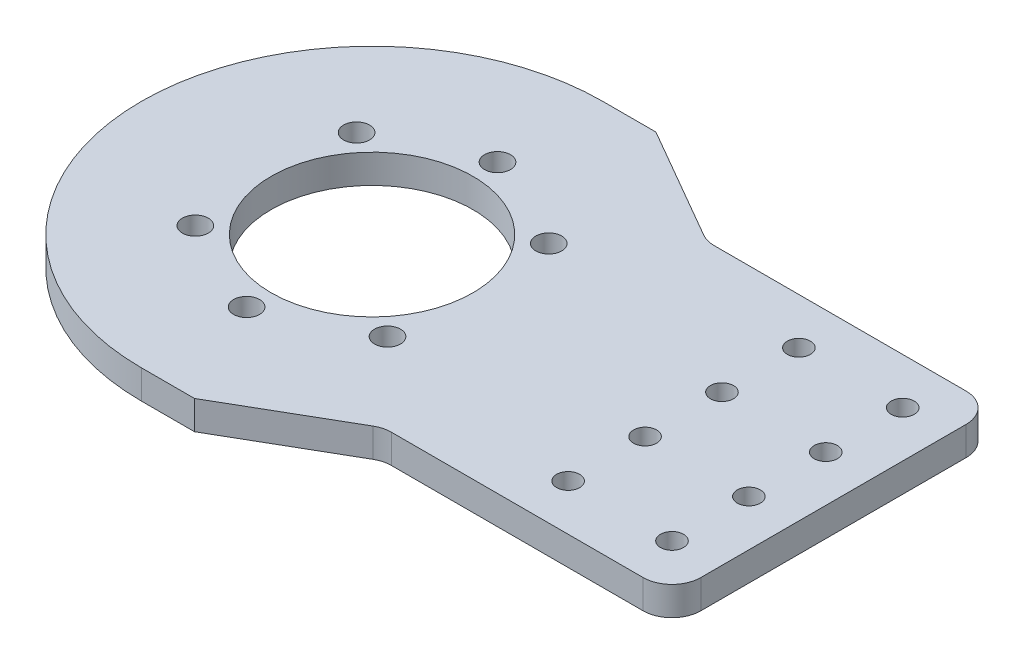
ISO-10303-21;
HEADER;
FILE_DESCRIPTION(('STEP AP214'),'2;1');
FILE_NAME('part.step','',(''),(''),'','','');
FILE_SCHEMA(('AUTOMOTIVE_DESIGN { 1 0 10303 214 1 1 1 1 }'));
ENDSEC;
DATA;
#1=APPLICATION_CONTEXT('core data for automotive mechanical design processes');
#2=APPLICATION_PROTOCOL_DEFINITION('international standard','automotive_design',2000,#1);
#3=PRODUCT_CONTEXT('',#1,'mechanical');
#4=PRODUCT('Part','Part','',(#3));
#5=PRODUCT_RELATED_PRODUCT_CATEGORY('part','',(#4));
#6=PRODUCT_DEFINITION_FORMATION('','',#4);
#7=PRODUCT_DEFINITION_CONTEXT('part definition',#1,'design');
#8=PRODUCT_DEFINITION('design','',#6,#7);
#9=PRODUCT_DEFINITION_SHAPE('','',#8);
#10=(LENGTH_UNIT() NAMED_UNIT(*) SI_UNIT(.MILLI.,.METRE.));
#11=(NAMED_UNIT(*) PLANE_ANGLE_UNIT() SI_UNIT($,.RADIAN.));
#12=(NAMED_UNIT(*) SI_UNIT($,.STERADIAN.) SOLID_ANGLE_UNIT());
#13=UNCERTAINTY_MEASURE_WITH_UNIT(LENGTH_MEASURE(1.E-05),#10,'distance_accuracy_value','');
#14=(GEOMETRIC_REPRESENTATION_CONTEXT(3) GLOBAL_UNCERTAINTY_ASSIGNED_CONTEXT((#13)) GLOBAL_UNIT_ASSIGNED_CONTEXT((#10,
#11,#12)) REPRESENTATION_CONTEXT('',''));
#15=CARTESIAN_POINT('',(0.,0.,0.));
#16=DIRECTION('',(0.,0.,1.));
#17=DIRECTION('',(1.,0.,0.));
#18=AXIS2_PLACEMENT_3D('',#15,#16,#17);
#19=CARTESIAN_POINT('',(-270.,-5.,95.));
#20=DIRECTION('',(0.,1.,0.));
#21=DIRECTION('',(0.,0.,1.));
#22=AXIS2_PLACEMENT_3D('',#19,#20,#21);
#23=PLANE('',#22);
#24=CARTESIAN_POINT('',(-229.338533362162,-5.,33.5193694893178));
#25=DIRECTION('',(0.,1.,0.));
#26=DIRECTION('',(0.,0.,1.));
#27=AXIS2_PLACEMENT_3D('',#24,#25,#26);
#28=CIRCLE('',#27,2.25000000000001);
#29=CARTESIAN_POINT('',(-229.338533362162,-5.,35.7693694893178));
#30=VERTEX_POINT('',#29);
#31=EDGE_CURVE('E199',#30,#30,#28,.T.);
#32=ORIENTED_EDGE('',*,*,#31,.T.);
#33=EDGE_LOOP('',(#32));
#34=FACE_BOUND('',#33,.T.);
#35=CARTESIAN_POINT('',(-262.661466637838,-5.,33.5193694893178));
#36=DIRECTION('',(0.,1.,0.));
#37=DIRECTION('',(0.,0.,1.));
#38=AXIS2_PLACEMENT_3D('',#35,#36,#37);
#39=CIRCLE('',#38,2.25000000000001);
#40=CARTESIAN_POINT('',(-262.661466637838,-5.,35.7693694893178));
#41=VERTEX_POINT('',#40);
#42=EDGE_CURVE('E226',#41,#41,#39,.T.);
#43=ORIENTED_EDGE('',*,*,#42,.T.);
#44=EDGE_LOOP('',(#43));
#45=FACE_BOUND('',#44,.T.);
#46=CARTESIAN_POINT('',(-262.661466637838,-5.,61.4806305106822));
#47=DIRECTION('',(0.,1.,0.));
#48=DIRECTION('',(0.,0.,1.));
#49=AXIS2_PLACEMENT_3D('',#46,#47,#48);
#50=CIRCLE('',#49,2.25000000000001);
#51=CARTESIAN_POINT('',(-262.661466637838,-5.,63.7306305106822));
#52=VERTEX_POINT('',#51);
#53=EDGE_CURVE('E230',#52,#52,#50,.T.);
#54=ORIENTED_EDGE('',*,*,#53,.T.);
#55=EDGE_LOOP('',(#54));
#56=FACE_BOUND('',#55,.T.);
#57=CARTESIAN_POINT('',(-246.,-5.,69.25));
#58=DIRECTION('',(0.,1.,0.));
#59=DIRECTION('',(0.,0.,1.));
#60=AXIS2_PLACEMENT_3D('',#57,#58,#59);
#61=CIRCLE('',#60,2.25000000000001);
#62=CARTESIAN_POINT('',(-246.,-5.,71.5));
#63=VERTEX_POINT('',#62);
#64=EDGE_CURVE('E234',#63,#63,#61,.T.);
#65=ORIENTED_EDGE('',*,*,#64,.T.);
#66=EDGE_LOOP('',(#65));
#67=FACE_BOUND('',#66,.T.);
#68=CARTESIAN_POINT('',(-246.,-5.,47.5));
#69=DIRECTION('',(0.,1.,0.));
#70=DIRECTION('',(0.,0.,1.));
#71=AXIS2_PLACEMENT_3D('',#68,#69,#70);
#72=CIRCLE('',#71,17.5);
#73=CARTESIAN_POINT('',(-246.,-5.,65.));
#74=VERTEX_POINT('',#73);
#75=EDGE_CURVE('E238',#74,#74,#72,.T.);
#76=ORIENTED_EDGE('',*,*,#75,.T.);
#77=EDGE_LOOP('',(#76));
#78=FACE_BOUND('',#77,.T.);
#79=CARTESIAN_POINT('',(-229.338533362162,-5.,61.4806305106822));
#80=DIRECTION('',(0.,1.,0.));
#81=DIRECTION('',(0.,0.,1.));
#82=AXIS2_PLACEMENT_3D('',#79,#80,#81);
#83=CIRCLE('',#82,2.25000000000001);
#84=CARTESIAN_POINT('',(-229.338533362162,-5.,63.7306305106822));
#85=VERTEX_POINT('',#84);
#86=EDGE_CURVE('E242',#85,#85,#83,.T.);
#87=ORIENTED_EDGE('',*,*,#86,.T.);
#88=EDGE_LOOP('',(#87));
#89=FACE_BOUND('',#88,.T.);
#90=CARTESIAN_POINT('',(-246.,-5.,25.75));
#91=DIRECTION('',(0.,1.,0.));
#92=DIRECTION('',(0.,0.,1.));
#93=AXIS2_PLACEMENT_3D('',#90,#91,#92);
#94=CIRCLE('',#93,2.25000000000001);
#95=CARTESIAN_POINT('',(-246.,-5.,28.));
#96=VERTEX_POINT('',#95);
#97=EDGE_CURVE('E246',#96,#96,#94,.T.);
#98=ORIENTED_EDGE('',*,*,#97,.T.);
#99=EDGE_LOOP('',(#98));
#100=FACE_BOUND('',#99,.T.);
#101=CARTESIAN_POINT('',(-192.,-5.,27.5));
#102=DIRECTION('',(0.,1.,0.));
#103=DIRECTION('',(0.,0.,1.));
#104=AXIS2_PLACEMENT_3D('',#101,#102,#103);
#105=CIRCLE('',#104,2.);
#106=CARTESIAN_POINT('',(-192.,-5.,29.5));
#107=VERTEX_POINT('',#106);
#108=EDGE_CURVE('E182',#107,#107,#105,.T.);
#109=ORIENTED_EDGE('',*,*,#108,.T.);
#110=EDGE_LOOP('',(#109));
#111=FACE_BOUND('',#110,.T.);
#112=CARTESIAN_POINT('',(-174.,-5.,27.5));
#113=DIRECTION('',(0.,1.,0.));
#114=DIRECTION('',(0.,0.,1.));
#115=AXIS2_PLACEMENT_3D('',#112,#113,#114);
#116=CIRCLE('',#115,2.);
#117=CARTESIAN_POINT('',(-174.,-5.,29.5));
#118=VERTEX_POINT('',#117);
#119=EDGE_CURVE('E329',#118,#118,#116,.T.);
#120=ORIENTED_EDGE('',*,*,#119,.T.);
#121=EDGE_LOOP('',(#120));
#122=FACE_BOUND('',#121,.T.);
#123=CARTESIAN_POINT('',(-174.,-5.,40.8333333333333));
#124=DIRECTION('',(0.,1.,0.));
#125=DIRECTION('',(0.,0.,1.));
#126=AXIS2_PLACEMENT_3D('',#123,#124,#125);
#127=CIRCLE('',#126,2.);
#128=CARTESIAN_POINT('',(-174.,-5.,42.8333333333333));
#129=VERTEX_POINT('',#128);
#130=EDGE_CURVE('E338',#129,#129,#127,.T.);
#131=ORIENTED_EDGE('',*,*,#130,.T.);
#132=EDGE_LOOP('',(#131));
#133=FACE_BOUND('',#132,.T.);
#134=CARTESIAN_POINT('',(-174.,-5.,54.1666666666667));
#135=DIRECTION('',(0.,1.,0.));
#136=DIRECTION('',(0.,0.,1.));
#137=AXIS2_PLACEMENT_3D('',#134,#135,#136);
#138=CIRCLE('',#137,2.);
#139=CARTESIAN_POINT('',(-174.,-5.,56.1666666666667));
#140=VERTEX_POINT('',#139);
#141=EDGE_CURVE('E346',#140,#140,#138,.T.);
#142=ORIENTED_EDGE('',*,*,#141,.T.);
#143=EDGE_LOOP('',(#142));
#144=FACE_BOUND('',#143,.T.);
#145=CARTESIAN_POINT('',(-174.,-5.,67.5));
#146=DIRECTION('',(0.,1.,0.));
#147=DIRECTION('',(0.,0.,1.));
#148=AXIS2_PLACEMENT_3D('',#145,#146,#147);
#149=CIRCLE('',#148,2.);
#150=CARTESIAN_POINT('',(-174.,-5.,69.5));
#151=VERTEX_POINT('',#150);
#152=EDGE_CURVE('E354',#151,#151,#149,.T.);
#153=ORIENTED_EDGE('',*,*,#152,.T.);
#154=EDGE_LOOP('',(#153));
#155=FACE_BOUND('',#154,.T.);
#156=CARTESIAN_POINT('',(-192.,-5.,40.8333333333333));
#157=DIRECTION('',(0.,1.,0.));
#158=DIRECTION('',(0.,0.,1.));
#159=AXIS2_PLACEMENT_3D('',#156,#157,#158);
#160=CIRCLE('',#159,2.);
#161=CARTESIAN_POINT('',(-192.,-5.,42.8333333333333));
#162=VERTEX_POINT('',#161);
#163=EDGE_CURVE('E362',#162,#162,#160,.T.);
#164=ORIENTED_EDGE('',*,*,#163,.T.);
#165=EDGE_LOOP('',(#164));
#166=FACE_BOUND('',#165,.T.);
#167=CARTESIAN_POINT('',(-192.,-5.,54.1666666666667));
#168=DIRECTION('',(0.,1.,0.));
#169=DIRECTION('',(0.,0.,1.));
#170=AXIS2_PLACEMENT_3D('',#167,#168,#169);
#171=CIRCLE('',#170,2.);
#172=CARTESIAN_POINT('',(-192.,-5.,56.1666666666667));
#173=VERTEX_POINT('',#172);
#174=EDGE_CURVE('E370',#173,#173,#171,.T.);
#175=ORIENTED_EDGE('',*,*,#174,.T.);
#176=EDGE_LOOP('',(#175));
#177=FACE_BOUND('',#176,.T.);
#178=CARTESIAN_POINT('',(-192.,-5.,67.5));
#179=DIRECTION('',(0.,1.,0.));
#180=DIRECTION('',(0.,0.,1.));
#181=AXIS2_PLACEMENT_3D('',#178,#179,#180);
#182=CIRCLE('',#181,2.);
#183=CARTESIAN_POINT('',(-192.,-5.,69.5));
#184=VERTEX_POINT('',#183);
#185=EDGE_CURVE('E378',#184,#184,#182,.T.);
#186=ORIENTED_EDGE('',*,*,#185,.T.);
#187=EDGE_LOOP('',(#186));
#188=FACE_BOUND('',#187,.T.);
#189=DIRECTION('',(0.,0.,-1.));
#190=VECTOR('',#189,1.);
#191=CARTESIAN_POINT('',(-166.,-5.,7.5));
#192=LINE('',#191,#190);
#193=CARTESIAN_POINT('',(-166.,-5.,70.5));
#194=VERTEX_POINT('',#193);
#195=CARTESIAN_POINT('',(-166.,-5.,24.5));
#196=VERTEX_POINT('',#195);
#197=EDGE_CURVE('E166',#194,#196,#192,.T.);
#198=ORIENTED_EDGE('',*,*,#197,.F.);
#199=CARTESIAN_POINT('',(-171.,-5.,70.5));
#200=DIRECTION('',(0.,1.,0.));
#201=DIRECTION('',(0.,0.,1.));
#202=AXIS2_PLACEMENT_3D('',#199,#200,#201);
#203=CIRCLE('',#202,5.);
#204=CARTESIAN_POINT('',(-171.,-5.,75.5));
#205=VERTEX_POINT('',#204);
#206=EDGE_CURVE('E273',#194,#205,#203,.F.);
#207=ORIENTED_EDGE('',*,*,#206,.T.);
#208=DIRECTION('',(1.,0.,0.));
#209=VECTOR('',#208,1.);
#210=CARTESIAN_POINT('',(0.,-5.,75.5));
#211=LINE('',#210,#209);
#212=CARTESIAN_POINT('',(-214.660254037844,-5.,75.5));
#213=VERTEX_POINT('',#212);
#214=EDGE_CURVE('E315',#213,#205,#211,.T.);
#215=ORIENTED_EDGE('',*,*,#214,.F.);
#216=CARTESIAN_POINT('',(-214.660254037844,-5.,80.5));
#217=DIRECTION('',(0.,1.,0.));
#218=DIRECTION('',(0.,0.,1.));
#219=AXIS2_PLACEMENT_3D('',#216,#217,#218);
#220=CIRCLE('',#219,5.);
#221=CARTESIAN_POINT('',(-217.160254037844,-5.,76.1698729810778));
#222=VERTEX_POINT('',#221);
#223=EDGE_CURVE('E59',#213,#222,#220,.T.);
#224=ORIENTED_EDGE('',*,*,#223,.T.);
#225=DIRECTION('',(0.866025403784438,0.,-0.500000000000001));
#226=VECTOR('',#225,1.);
#227=CARTESIAN_POINT('',(-21.3075410071376,-5.,-36.9057436087196));
#228=LINE('',#227,#226);
#229=CARTESIAN_POINT('',(-236.784609690826,-5.,87.5));
#230=VERTEX_POINT('',#229);
#231=EDGE_CURVE('E312',#230,#222,#228,.T.);
#232=ORIENTED_EDGE('',*,*,#231,.F.);
#233=DIRECTION('',(1.,0.,0.));
#234=VECTOR('',#233,1.);
#235=CARTESIAN_POINT('',(-246.,-5.,87.5));
#236=LINE('',#235,#234);
#237=CARTESIAN_POINT('',(-246.,-5.,87.5));
#238=VERTEX_POINT('',#237);
#239=EDGE_CURVE('E173',#238,#230,#236,.T.);
#240=ORIENTED_EDGE('',*,*,#239,.F.);
#241=CARTESIAN_POINT('',(-246.,-5.,47.5));
#242=DIRECTION('',(0.,1.,0.));
#243=DIRECTION('',(0.,0.,1.));
#244=AXIS2_PLACEMENT_3D('',#241,#242,#243);
#245=CIRCLE('',#244,40.);
#246=CARTESIAN_POINT('',(-246.,-5.,7.49999999999999));
#247=VERTEX_POINT('',#246);
#248=EDGE_CURVE('E163',#247,#238,#245,.T.);
#249=ORIENTED_EDGE('',*,*,#248,.F.);
#250=DIRECTION('',(-1.,0.,0.));
#251=VECTOR('',#250,1.);
#252=CARTESIAN_POINT('',(-246.,-5.,7.49999999999999));
#253=LINE('',#252,#251);
#254=CARTESIAN_POINT('',(-236.784609690826,-5.,7.49999999999999));
#255=VERTEX_POINT('',#254);
#256=EDGE_CURVE('E153',#255,#247,#253,.T.);
#257=ORIENTED_EDGE('',*,*,#256,.F.);
#258=DIRECTION('',(0.866025403784438,0.,0.500000000000001));
#259=VECTOR('',#258,1.);
#260=CARTESIAN_POINT('',(-62.4437476868986,-5.,108.15574360872));
#261=LINE('',#260,#259);
#262=CARTESIAN_POINT('',(-217.160254037844,-5.,18.8301270189222));
#263=VERTEX_POINT('',#262);
#264=EDGE_CURVE('E135',#255,#263,#261,.T.);
#265=ORIENTED_EDGE('',*,*,#264,.T.);
#266=CARTESIAN_POINT('',(-214.660254037844,-5.,14.5));
#267=DIRECTION('',(0.,1.,0.));
#268=DIRECTION('',(0.,0.,1.));
#269=AXIS2_PLACEMENT_3D('',#266,#267,#268);
#270=CIRCLE('',#269,5.);
#271=CARTESIAN_POINT('',(-214.660254037844,-5.,19.5));
#272=VERTEX_POINT('',#271);
#273=EDGE_CURVE('E11',#263,#272,#270,.T.);
#274=ORIENTED_EDGE('',*,*,#273,.T.);
#275=DIRECTION('',(1.,0.,0.));
#276=VECTOR('',#275,1.);
#277=CARTESIAN_POINT('',(0.,-5.,19.5));
#278=LINE('',#277,#276);
#279=CARTESIAN_POINT('',(-171.,-5.,19.5));
#280=VERTEX_POINT('',#279);
#281=EDGE_CURVE('E146',#272,#280,#278,.T.);
#282=ORIENTED_EDGE('',*,*,#281,.T.);
#283=CARTESIAN_POINT('',(-171.,-5.,24.5));
#284=DIRECTION('',(0.,1.,0.));
#285=DIRECTION('',(0.,0.,1.));
#286=AXIS2_PLACEMENT_3D('',#283,#284,#285);
#287=CIRCLE('',#286,5.);
#288=EDGE_CURVE('E270',#280,#196,#287,.F.);
#289=ORIENTED_EDGE('',*,*,#288,.T.);
#290=EDGE_LOOP('',(#198,#207,#215,#224,#232,#240,#249,#257,#265,#274,#282,#289));
#291=FACE_BOUND('',#290,.T.);
#292=ADVANCED_FACE('F43',(#34,#45,#56,#67,#78,#89,#100,#111,#122,#133,#144,#155,#166,#177,#188,
#291),#23,.F.);
#293=CARTESIAN_POINT('',(-270.,0.,95.));
#294=DIRECTION('',(0.,1.,0.));
#295=DIRECTION('',(0.,0.,1.));
#296=AXIS2_PLACEMENT_3D('',#293,#294,#295);
#297=PLANE('',#296);
#298=DIRECTION('',(1.,0.,0.));
#299=VECTOR('',#298,1.);
#300=CARTESIAN_POINT('',(0.,0.,75.5));
#301=LINE('',#300,#299);
#302=CARTESIAN_POINT('',(-214.660254037844,0.,75.5));
#303=VERTEX_POINT('',#302);
#304=CARTESIAN_POINT('',(-171.,0.,75.5));
#305=VERTEX_POINT('',#304);
#306=EDGE_CURVE('E316',#303,#305,#301,.T.);
#307=ORIENTED_EDGE('',*,*,#306,.T.);
#308=CARTESIAN_POINT('',(-171.,0.,70.5));
#309=DIRECTION('',(0.,1.,0.));
#310=DIRECTION('',(0.,0.,1.));
#311=AXIS2_PLACEMENT_3D('',#308,#309,#310);
#312=CIRCLE('',#311,5.);
#313=CARTESIAN_POINT('',(-166.,0.,70.5));
#314=VERTEX_POINT('',#313);
#315=EDGE_CURVE('E260',#305,#314,#312,.T.);
#316=ORIENTED_EDGE('',*,*,#315,.T.);
#317=DIRECTION('',(0.,0.,-1.));
#318=VECTOR('',#317,1.);
#319=CARTESIAN_POINT('',(-166.,0.,7.5));
#320=LINE('',#319,#318);
#321=CARTESIAN_POINT('',(-166.,0.,24.5));
#322=VERTEX_POINT('',#321);
#323=EDGE_CURVE('E186',#314,#322,#320,.T.);
#324=ORIENTED_EDGE('',*,*,#323,.T.);
#325=CARTESIAN_POINT('',(-171.,0.,24.5));
#326=DIRECTION('',(0.,1.,0.));
#327=DIRECTION('',(0.,0.,1.));
#328=AXIS2_PLACEMENT_3D('',#325,#326,#327);
#329=CIRCLE('',#328,5.);
#330=CARTESIAN_POINT('',(-171.,0.,19.5));
#331=VERTEX_POINT('',#330);
#332=EDGE_CURVE('E257',#322,#331,#329,.T.);
#333=ORIENTED_EDGE('',*,*,#332,.T.);
#334=DIRECTION('',(1.,0.,0.));
#335=VECTOR('',#334,1.);
#336=CARTESIAN_POINT('',(0.,0.,19.5));
#337=LINE('',#336,#335);
#338=CARTESIAN_POINT('',(-214.660254037844,0.,19.5));
#339=VERTEX_POINT('',#338);
#340=EDGE_CURVE('E147',#339,#331,#337,.T.);
#341=ORIENTED_EDGE('',*,*,#340,.F.);
#342=CARTESIAN_POINT('',(-214.660254037844,0.,14.5));
#343=DIRECTION('',(0.,1.,0.));
#344=DIRECTION('',(0.,0.,1.));
#345=AXIS2_PLACEMENT_3D('',#342,#343,#344);
#346=CIRCLE('',#345,5.);
#347=CARTESIAN_POINT('',(-217.160254037844,0.,18.8301270189222));
#348=VERTEX_POINT('',#347);
#349=EDGE_CURVE('E52',#339,#348,#346,.F.);
#350=ORIENTED_EDGE('',*,*,#349,.T.);
#351=DIRECTION('',(0.866025403784438,0.,0.500000000000001));
#352=VECTOR('',#351,1.);
#353=CARTESIAN_POINT('',(-62.4437476868986,0.,108.15574360872));
#354=LINE('',#353,#352);
#355=CARTESIAN_POINT('',(-236.784609690826,0.,7.49999999999999));
#356=VERTEX_POINT('',#355);
#357=EDGE_CURVE('E298',#356,#348,#354,.T.);
#358=ORIENTED_EDGE('',*,*,#357,.F.);
#359=DIRECTION('',(-1.,0.,0.));
#360=VECTOR('',#359,1.);
#361=CARTESIAN_POINT('',(-246.,0.,7.49999999999999));
#362=LINE('',#361,#360);
#363=CARTESIAN_POINT('',(-246.,0.,7.49999999999999));
#364=VERTEX_POINT('',#363);
#365=EDGE_CURVE('E155',#356,#364,#362,.T.);
#366=ORIENTED_EDGE('',*,*,#365,.T.);
#367=CARTESIAN_POINT('',(-246.,0.,47.5));
#368=DIRECTION('',(0.,1.,0.));
#369=DIRECTION('',(0.,0.,1.));
#370=AXIS2_PLACEMENT_3D('',#367,#368,#369);
#371=CIRCLE('',#370,40.);
#372=CARTESIAN_POINT('',(-246.,0.,87.5));
#373=VERTEX_POINT('',#372);
#374=EDGE_CURVE('E177',#364,#373,#371,.T.);
#375=ORIENTED_EDGE('',*,*,#374,.T.);
#376=DIRECTION('',(1.,0.,0.));
#377=VECTOR('',#376,1.);
#378=CARTESIAN_POINT('',(-246.,0.,87.5));
#379=LINE('',#378,#377);
#380=CARTESIAN_POINT('',(-236.784609690826,0.,87.5));
#381=VERTEX_POINT('',#380);
#382=EDGE_CURVE('E181',#373,#381,#379,.T.);
#383=ORIENTED_EDGE('',*,*,#382,.T.);
#384=DIRECTION('',(0.866025403784438,0.,-0.500000000000001));
#385=VECTOR('',#384,1.);
#386=CARTESIAN_POINT('',(-21.3075410071376,0.,-36.9057436087196));
#387=LINE('',#386,#385);
#388=CARTESIAN_POINT('',(-217.160254037844,0.,76.1698729810778));
#389=VERTEX_POINT('',#388);
#390=EDGE_CURVE('E320',#381,#389,#387,.T.);
#391=ORIENTED_EDGE('',*,*,#390,.T.);
#392=CARTESIAN_POINT('',(-214.660254037844,0.,80.5));
#393=DIRECTION('',(0.,1.,0.));
#394=DIRECTION('',(0.,0.,1.));
#395=AXIS2_PLACEMENT_3D('',#392,#393,#394);
#396=CIRCLE('',#395,5.);
#397=EDGE_CURVE('E288',#389,#303,#396,.F.);
#398=ORIENTED_EDGE('',*,*,#397,.T.);
#399=EDGE_LOOP('',(#307,#316,#324,#333,#341,#350,#358,#366,#375,#383,#391,#398));
#400=FACE_BOUND('',#399,.T.);
#401=CARTESIAN_POINT('',(-192.,0.,67.5));
#402=DIRECTION('',(0.,1.,0.));
#403=DIRECTION('',(0.,0.,1.));
#404=AXIS2_PLACEMENT_3D('',#401,#402,#403);
#405=CIRCLE('',#404,2.);
#406=CARTESIAN_POINT('',(-192.,0.,69.5));
#407=VERTEX_POINT('',#406);
#408=EDGE_CURVE('E157',#407,#407,#405,.T.);
#409=ORIENTED_EDGE('',*,*,#408,.F.);
#410=EDGE_LOOP('',(#409));
#411=FACE_BOUND('',#410,.T.);
#412=CARTESIAN_POINT('',(-192.,0.,54.1666666666667));
#413=DIRECTION('',(0.,1.,0.));
#414=DIRECTION('',(0.,0.,1.));
#415=AXIS2_PLACEMENT_3D('',#412,#413,#414);
#416=CIRCLE('',#415,2.);
#417=CARTESIAN_POINT('',(-192.,0.,56.1666666666667));
#418=VERTEX_POINT('',#417);
#419=EDGE_CURVE('E374',#418,#418,#416,.T.);
#420=ORIENTED_EDGE('',*,*,#419,.F.);
#421=EDGE_LOOP('',(#420));
#422=FACE_BOUND('',#421,.T.);
#423=CARTESIAN_POINT('',(-192.,0.,40.8333333333333));
#424=DIRECTION('',(0.,1.,0.));
#425=DIRECTION('',(0.,0.,1.));
#426=AXIS2_PLACEMENT_3D('',#423,#424,#425);
#427=CIRCLE('',#426,2.);
#428=CARTESIAN_POINT('',(-192.,0.,42.8333333333333));
#429=VERTEX_POINT('',#428);
#430=EDGE_CURVE('E366',#429,#429,#427,.T.);
#431=ORIENTED_EDGE('',*,*,#430,.F.);
#432=EDGE_LOOP('',(#431));
#433=FACE_BOUND('',#432,.T.);
#434=CARTESIAN_POINT('',(-174.,0.,67.5));
#435=DIRECTION('',(0.,1.,0.));
#436=DIRECTION('',(0.,0.,1.));
#437=AXIS2_PLACEMENT_3D('',#434,#435,#436);
#438=CIRCLE('',#437,2.);
#439=CARTESIAN_POINT('',(-174.,0.,69.5));
#440=VERTEX_POINT('',#439);
#441=EDGE_CURVE('E358',#440,#440,#438,.T.);
#442=ORIENTED_EDGE('',*,*,#441,.F.);
#443=EDGE_LOOP('',(#442));
#444=FACE_BOUND('',#443,.T.);
#445=CARTESIAN_POINT('',(-174.,0.,54.1666666666667));
#446=DIRECTION('',(0.,1.,0.));
#447=DIRECTION('',(0.,0.,1.));
#448=AXIS2_PLACEMENT_3D('',#445,#446,#447);
#449=CIRCLE('',#448,2.);
#450=CARTESIAN_POINT('',(-174.,0.,56.1666666666667));
#451=VERTEX_POINT('',#450);
#452=EDGE_CURVE('E350',#451,#451,#449,.T.);
#453=ORIENTED_EDGE('',*,*,#452,.F.);
#454=EDGE_LOOP('',(#453));
#455=FACE_BOUND('',#454,.T.);
#456=CARTESIAN_POINT('',(-174.,0.,40.8333333333333));
#457=DIRECTION('',(0.,1.,0.));
#458=DIRECTION('',(0.,0.,1.));
#459=AXIS2_PLACEMENT_3D('',#456,#457,#458);
#460=CIRCLE('',#459,2.);
#461=CARTESIAN_POINT('',(-174.,0.,42.8333333333333));
#462=VERTEX_POINT('',#461);
#463=EDGE_CURVE('E342',#462,#462,#460,.T.);
#464=ORIENTED_EDGE('',*,*,#463,.F.);
#465=EDGE_LOOP('',(#464));
#466=FACE_BOUND('',#465,.T.);
#467=CARTESIAN_POINT('',(-174.,0.,27.5));
#468=DIRECTION('',(0.,1.,0.));
#469=DIRECTION('',(0.,0.,1.));
#470=AXIS2_PLACEMENT_3D('',#467,#468,#469);
#471=CIRCLE('',#470,2.);
#472=CARTESIAN_POINT('',(-174.,0.,29.5));
#473=VERTEX_POINT('',#472);
#474=EDGE_CURVE('E334',#473,#473,#471,.T.);
#475=ORIENTED_EDGE('',*,*,#474,.F.);
#476=EDGE_LOOP('',(#475));
#477=FACE_BOUND('',#476,.T.);
#478=CARTESIAN_POINT('',(-192.,0.,27.5));
#479=DIRECTION('',(0.,1.,0.));
#480=DIRECTION('',(0.,0.,1.));
#481=AXIS2_PLACEMENT_3D('',#478,#479,#480);
#482=CIRCLE('',#481,2.);
#483=CARTESIAN_POINT('',(-192.,0.,29.5));
#484=VERTEX_POINT('',#483);
#485=EDGE_CURVE('E333',#484,#484,#482,.T.);
#486=ORIENTED_EDGE('',*,*,#485,.F.);
#487=EDGE_LOOP('',(#486));
#488=FACE_BOUND('',#487,.T.);
#489=CARTESIAN_POINT('',(-246.,0.,25.75));
#490=DIRECTION('',(0.,1.,0.));
#491=DIRECTION('',(0.,0.,1.));
#492=AXIS2_PLACEMENT_3D('',#489,#490,#491);
#493=CIRCLE('',#492,2.25000000000001);
#494=CARTESIAN_POINT('',(-246.,0.,28.));
#495=VERTEX_POINT('',#494);
#496=EDGE_CURVE('E195',#495,#495,#493,.T.);
#497=ORIENTED_EDGE('',*,*,#496,.F.);
#498=EDGE_LOOP('',(#497));
#499=FACE_BOUND('',#498,.T.);
#500=CARTESIAN_POINT('',(-229.338533362162,0.,61.4806305106822));
#501=DIRECTION('',(0.,1.,0.));
#502=DIRECTION('',(0.,0.,-1.));
#503=AXIS2_PLACEMENT_3D('',#500,#501,#502);
#504=CIRCLE('',#503,2.25000000000001);
#505=CARTESIAN_POINT('',(-229.338533362162,0.,59.2306305106822));
#506=VERTEX_POINT('',#505);
#507=EDGE_CURVE('E204',#506,#506,#504,.T.);
#508=ORIENTED_EDGE('',*,*,#507,.F.);
#509=EDGE_LOOP('',(#508));
#510=FACE_BOUND('',#509,.T.);
#511=CARTESIAN_POINT('',(-246.,0.,47.5));
#512=DIRECTION('',(0.,1.,0.));
#513=DIRECTION('',(0.,0.,1.));
#514=AXIS2_PLACEMENT_3D('',#511,#512,#513);
#515=CIRCLE('',#514,17.5);
#516=CARTESIAN_POINT('',(-246.,0.,65.));
#517=VERTEX_POINT('',#516);
#518=EDGE_CURVE('E193',#517,#517,#515,.T.);
#519=ORIENTED_EDGE('',*,*,#518,.F.);
#520=EDGE_LOOP('',(#519));
#521=FACE_BOUND('',#520,.T.);
#522=CARTESIAN_POINT('',(-246.,0.,69.25));
#523=DIRECTION('',(0.,1.,0.));
#524=DIRECTION('',(0.,0.,-1.));
#525=AXIS2_PLACEMENT_3D('',#522,#523,#524);
#526=CIRCLE('',#525,2.25000000000001);
#527=CARTESIAN_POINT('',(-246.,0.,67.));
#528=VERTEX_POINT('',#527);
#529=EDGE_CURVE('E208',#528,#528,#526,.T.);
#530=ORIENTED_EDGE('',*,*,#529,.F.);
#531=EDGE_LOOP('',(#530));
#532=FACE_BOUND('',#531,.T.);
#533=CARTESIAN_POINT('',(-262.661466637838,0.,61.4806305106822));
#534=DIRECTION('',(0.,1.,0.));
#535=DIRECTION('',(0.,0.,1.));
#536=AXIS2_PLACEMENT_3D('',#533,#534,#535);
#537=CIRCLE('',#536,2.25000000000001);
#538=CARTESIAN_POINT('',(-262.661466637838,0.,63.7306305106822));
#539=VERTEX_POINT('',#538);
#540=EDGE_CURVE('E216',#539,#539,#537,.T.);
#541=ORIENTED_EDGE('',*,*,#540,.F.);
#542=EDGE_LOOP('',(#541));
#543=FACE_BOUND('',#542,.T.);
#544=CARTESIAN_POINT('',(-262.661466637838,0.,33.5193694893178));
#545=DIRECTION('',(0.,1.,0.));
#546=DIRECTION('',(0.,0.,-1.));
#547=AXIS2_PLACEMENT_3D('',#544,#545,#546);
#548=CIRCLE('',#547,2.25000000000001);
#549=CARTESIAN_POINT('',(-262.661466637838,0.,31.2693694893178));
#550=VERTEX_POINT('',#549);
#551=EDGE_CURVE('E212',#550,#550,#548,.T.);
#552=ORIENTED_EDGE('',*,*,#551,.F.);
#553=EDGE_LOOP('',(#552));
#554=FACE_BOUND('',#553,.T.);
#555=CARTESIAN_POINT('',(-229.338533362162,0.,33.5193694893178));
#556=DIRECTION('',(0.,1.,0.));
#557=DIRECTION('',(0.,0.,1.));
#558=AXIS2_PLACEMENT_3D('',#555,#556,#557);
#559=CIRCLE('',#558,2.25000000000001);
#560=CARTESIAN_POINT('',(-229.338533362162,0.,35.7693694893178));
#561=VERTEX_POINT('',#560);
#562=EDGE_CURVE('E200',#561,#561,#559,.T.);
#563=ORIENTED_EDGE('',*,*,#562,.F.);
#564=EDGE_LOOP('',(#563));
#565=FACE_BOUND('',#564,.T.);
#566=ADVANCED_FACE('F296',(#400,#411,#422,#433,#444,#455,#466,#477,#488,#499,#510,#521,#532,
#543,#554,#565),#297,.T.);
#567=CARTESIAN_POINT('',(-166.,-5.,7.5));
#568=DIRECTION('',(1.,0.,0.));
#569=DIRECTION('',(0.,0.,-1.));
#570=AXIS2_PLACEMENT_3D('',#567,#568,#569);
#571=PLANE('',#570);
#572=ORIENTED_EDGE('',*,*,#323,.F.);
#573=DIRECTION('',(0.,1.,0.));
#574=VECTOR('',#573,1.);
#575=CARTESIAN_POINT('',(-166.,-5.,70.5));
#576=LINE('',#575,#574);
#577=EDGE_CURVE('E267',#314,#194,#576,.F.);
#578=ORIENTED_EDGE('',*,*,#577,.T.);
#579=ORIENTED_EDGE('',*,*,#197,.T.);
#580=DIRECTION('',(0.,1.,0.));
#581=VECTOR('',#580,1.);
#582=CARTESIAN_POINT('',(-166.,0.,24.5));
#583=LINE('',#582,#581);
#584=EDGE_CURVE('E263',#196,#322,#583,.T.);
#585=ORIENTED_EDGE('',*,*,#584,.T.);
#586=EDGE_LOOP('',(#572,#578,#579,#585));
#587=FACE_BOUND('',#586,.T.);
#588=ADVANCED_FACE('F416',(#587),#571,.T.);
#589=CARTESIAN_POINT('',(-246.,-5.,87.5));
#590=DIRECTION('',(0.,0.,1.));
#591=DIRECTION('',(1.,0.,0.));
#592=AXIS2_PLACEMENT_3D('',#589,#590,#591);
#593=PLANE('',#592);
#594=ORIENTED_EDGE('',*,*,#239,.T.);
#595=DIRECTION('',(0.,1.,0.));
#596=VECTOR('',#595,1.);
#597=CARTESIAN_POINT('',(-236.784609690826,-5.,87.5));
#598=LINE('',#597,#596);
#599=EDGE_CURVE('E302',#230,#381,#598,.T.);
#600=ORIENTED_EDGE('',*,*,#599,.T.);
#601=ORIENTED_EDGE('',*,*,#382,.F.);
#602=DIRECTION('',(0.,1.,0.));
#603=VECTOR('',#602,1.);
#604=CARTESIAN_POINT('',(-246.,-5.,87.5));
#605=LINE('',#604,#603);
#606=EDGE_CURVE('E165',#238,#373,#605,.T.);
#607=ORIENTED_EDGE('',*,*,#606,.F.);
#608=EDGE_LOOP('',(#594,#600,#601,#607));
#609=FACE_BOUND('',#608,.T.);
#610=ADVANCED_FACE('F395',(#609),#593,.T.);
#611=CARTESIAN_POINT('',(-229.338533362162,-10.,33.5193694893178));
#612=DIRECTION('',(0.,1.,0.));
#613=DIRECTION('',(0.,0.,1.));
#614=AXIS2_PLACEMENT_3D('',#611,#612,#613);
#615=CYLINDRICAL_SURFACE('',#614,2.25000000000001);
#616=ORIENTED_EDGE('',*,*,#562,.T.);
#617=EDGE_LOOP('',(#616));
#618=FACE_BOUND('',#617,.T.);
#619=ORIENTED_EDGE('',*,*,#31,.F.);
#620=EDGE_LOOP('',(#619));
#621=FACE_BOUND('',#620,.T.);
#622=ADVANCED_FACE('F518',(#618,#621),#615,.F.);
#623=CARTESIAN_POINT('',(-262.661466637838,-10.,33.5193694893178));
#624=DIRECTION('',(0.,1.,0.));
#625=DIRECTION('',(0.,0.,1.));
#626=AXIS2_PLACEMENT_3D('',#623,#624,#625);
#627=CYLINDRICAL_SURFACE('',#626,2.25000000000001);
#628=ORIENTED_EDGE('',*,*,#551,.T.);
#629=EDGE_LOOP('',(#628));
#630=FACE_BOUND('',#629,.T.);
#631=ORIENTED_EDGE('',*,*,#42,.F.);
#632=EDGE_LOOP('',(#631));
#633=FACE_BOUND('',#632,.T.);
#634=ADVANCED_FACE('F525',(#630,#633),#627,.F.);
#635=CARTESIAN_POINT('',(-262.661466637838,-10.,61.4806305106822));
#636=DIRECTION('',(0.,1.,0.));
#637=DIRECTION('',(0.,0.,1.));
#638=AXIS2_PLACEMENT_3D('',#635,#636,#637);
#639=CYLINDRICAL_SURFACE('',#638,2.25000000000001);
#640=ORIENTED_EDGE('',*,*,#540,.T.);
#641=EDGE_LOOP('',(#640));
#642=FACE_BOUND('',#641,.T.);
#643=ORIENTED_EDGE('',*,*,#53,.F.);
#644=EDGE_LOOP('',(#643));
#645=FACE_BOUND('',#644,.T.);
#646=ADVANCED_FACE('F533',(#642,#645),#639,.F.);
#647=CARTESIAN_POINT('',(-246.,-10.,69.25));
#648=DIRECTION('',(0.,1.,0.));
#649=DIRECTION('',(0.,0.,1.));
#650=AXIS2_PLACEMENT_3D('',#647,#648,#649);
#651=CYLINDRICAL_SURFACE('',#650,2.25000000000001);
#652=ORIENTED_EDGE('',*,*,#529,.T.);
#653=EDGE_LOOP('',(#652));
#654=FACE_BOUND('',#653,.T.);
#655=ORIENTED_EDGE('',*,*,#64,.F.);
#656=EDGE_LOOP('',(#655));
#657=FACE_BOUND('',#656,.T.);
#658=ADVANCED_FACE('F541',(#654,#657),#651,.F.);
#659=CARTESIAN_POINT('',(-246.,-10.,47.5));
#660=DIRECTION('',(0.,1.,0.));
#661=DIRECTION('',(0.,0.,1.));
#662=AXIS2_PLACEMENT_3D('',#659,#660,#661);
#663=CYLINDRICAL_SURFACE('',#662,17.5);
#664=ORIENTED_EDGE('',*,*,#518,.T.);
#665=EDGE_LOOP('',(#664));
#666=FACE_BOUND('',#665,.T.);
#667=ORIENTED_EDGE('',*,*,#75,.F.);
#668=EDGE_LOOP('',(#667));
#669=FACE_BOUND('',#668,.T.);
#670=ADVANCED_FACE('F549',(#666,#669),#663,.F.);
#671=CARTESIAN_POINT('',(-229.338533362162,-10.,61.4806305106822));
#672=DIRECTION('',(0.,1.,0.));
#673=DIRECTION('',(0.,0.,1.));
#674=AXIS2_PLACEMENT_3D('',#671,#672,#673);
#675=CYLINDRICAL_SURFACE('',#674,2.25000000000001);
#676=ORIENTED_EDGE('',*,*,#507,.T.);
#677=EDGE_LOOP('',(#676));
#678=FACE_BOUND('',#677,.T.);
#679=ORIENTED_EDGE('',*,*,#86,.F.);
#680=EDGE_LOOP('',(#679));
#681=FACE_BOUND('',#680,.T.);
#682=ADVANCED_FACE('F556',(#678,#681),#675,.F.);
#683=CARTESIAN_POINT('',(-246.,-10.,25.75));
#684=DIRECTION('',(0.,1.,0.));
#685=DIRECTION('',(0.,0.,1.));
#686=AXIS2_PLACEMENT_3D('',#683,#684,#685);
#687=CYLINDRICAL_SURFACE('',#686,2.25000000000001);
#688=ORIENTED_EDGE('',*,*,#496,.T.);
#689=EDGE_LOOP('',(#688));
#690=FACE_BOUND('',#689,.T.);
#691=ORIENTED_EDGE('',*,*,#97,.F.);
#692=EDGE_LOOP('',(#691));
#693=FACE_BOUND('',#692,.T.);
#694=ADVANCED_FACE('F564',(#690,#693),#687,.F.);
#695=CARTESIAN_POINT('',(-246.,-5.,47.5));
#696=DIRECTION('',(0.,1.,0.));
#697=DIRECTION('',(0.,0.,1.));
#698=AXIS2_PLACEMENT_3D('',#695,#696,#697);
#699=CYLINDRICAL_SURFACE('',#698,40.);
#700=ORIENTED_EDGE('',*,*,#374,.F.);
#701=DIRECTION('',(0.,1.,0.));
#702=VECTOR('',#701,1.);
#703=CARTESIAN_POINT('',(-246.,-5.,7.49999999999999));
#704=LINE('',#703,#702);
#705=EDGE_CURVE('E170',#247,#364,#704,.T.);
#706=ORIENTED_EDGE('',*,*,#705,.F.);
#707=ORIENTED_EDGE('',*,*,#248,.T.);
#708=ORIENTED_EDGE('',*,*,#606,.T.);
#709=EDGE_LOOP('',(#700,#706,#707,#708));
#710=FACE_BOUND('',#709,.T.);
#711=ADVANCED_FACE('F399',(#710),#699,.T.);
#712=CARTESIAN_POINT('',(-246.,-5.,7.49999999999999));
#713=DIRECTION('',(0.,0.,-1.));
#714=DIRECTION('',(-1.,0.,0.));
#715=AXIS2_PLACEMENT_3D('',#712,#713,#714);
#716=PLANE('',#715);
#717=DIRECTION('',(0.,1.,0.));
#718=VECTOR('',#717,1.);
#719=CARTESIAN_POINT('',(-236.784609690826,-5.,7.49999999999999));
#720=LINE('',#719,#718);
#721=EDGE_CURVE('E139',#255,#356,#720,.T.);
#722=ORIENTED_EDGE('',*,*,#721,.F.);
#723=ORIENTED_EDGE('',*,*,#256,.T.);
#724=ORIENTED_EDGE('',*,*,#705,.T.);
#725=ORIENTED_EDGE('',*,*,#365,.F.);
#726=EDGE_LOOP('',(#722,#723,#724,#725));
#727=FACE_BOUND('',#726,.T.);
#728=ADVANCED_FACE('F151',(#727),#716,.T.);
#729=CARTESIAN_POINT('',(-192.,-5.,27.5));
#730=DIRECTION('',(0.,1.,0.));
#731=DIRECTION('',(0.,0.,1.));
#732=AXIS2_PLACEMENT_3D('',#729,#730,#731);
#733=CYLINDRICAL_SURFACE('',#732,2.);
#734=ORIENTED_EDGE('',*,*,#108,.F.);
#735=EDGE_LOOP('',(#734));
#736=FACE_BOUND('',#735,.T.);
#737=ORIENTED_EDGE('',*,*,#485,.T.);
#738=EDGE_LOOP('',(#737));
#739=FACE_BOUND('',#738,.T.);
#740=ADVANCED_FACE('F584',(#736,#739),#733,.F.);
#741=CARTESIAN_POINT('',(-174.,-5.,27.5));
#742=DIRECTION('',(0.,1.,0.));
#743=DIRECTION('',(0.,0.,1.));
#744=AXIS2_PLACEMENT_3D('',#741,#742,#743);
#745=CYLINDRICAL_SURFACE('',#744,2.);
#746=ORIENTED_EDGE('',*,*,#119,.F.);
#747=EDGE_LOOP('',(#746));
#748=FACE_BOUND('',#747,.T.);
#749=ORIENTED_EDGE('',*,*,#474,.T.);
#750=EDGE_LOOP('',(#749));
#751=FACE_BOUND('',#750,.T.);
#752=ADVANCED_FACE('F588',(#748,#751),#745,.F.);
#753=CARTESIAN_POINT('',(-174.,-5.,40.8333333333333));
#754=DIRECTION('',(0.,1.,0.));
#755=DIRECTION('',(0.,0.,1.));
#756=AXIS2_PLACEMENT_3D('',#753,#754,#755);
#757=CYLINDRICAL_SURFACE('',#756,2.);
#758=ORIENTED_EDGE('',*,*,#130,.F.);
#759=EDGE_LOOP('',(#758));
#760=FACE_BOUND('',#759,.T.);
#761=ORIENTED_EDGE('',*,*,#463,.T.);
#762=EDGE_LOOP('',(#761));
#763=FACE_BOUND('',#762,.T.);
#764=ADVANCED_FACE('F596',(#760,#763),#757,.F.);
#765=CARTESIAN_POINT('',(-174.,-5.,54.1666666666667));
#766=DIRECTION('',(0.,1.,0.));
#767=DIRECTION('',(0.,0.,1.));
#768=AXIS2_PLACEMENT_3D('',#765,#766,#767);
#769=CYLINDRICAL_SURFACE('',#768,2.);
#770=ORIENTED_EDGE('',*,*,#141,.F.);
#771=EDGE_LOOP('',(#770));
#772=FACE_BOUND('',#771,.T.);
#773=ORIENTED_EDGE('',*,*,#452,.T.);
#774=EDGE_LOOP('',(#773));
#775=FACE_BOUND('',#774,.T.);
#776=ADVANCED_FACE('F604',(#772,#775),#769,.F.);
#777=CARTESIAN_POINT('',(-174.,-5.,67.5));
#778=DIRECTION('',(0.,1.,0.));
#779=DIRECTION('',(0.,0.,1.));
#780=AXIS2_PLACEMENT_3D('',#777,#778,#779);
#781=CYLINDRICAL_SURFACE('',#780,2.);
#782=ORIENTED_EDGE('',*,*,#152,.F.);
#783=EDGE_LOOP('',(#782));
#784=FACE_BOUND('',#783,.T.);
#785=ORIENTED_EDGE('',*,*,#441,.T.);
#786=EDGE_LOOP('',(#785));
#787=FACE_BOUND('',#786,.T.);
#788=ADVANCED_FACE('F612',(#784,#787),#781,.F.);
#789=CARTESIAN_POINT('',(-192.,-5.,40.8333333333333));
#790=DIRECTION('',(0.,1.,0.));
#791=DIRECTION('',(0.,0.,1.));
#792=AXIS2_PLACEMENT_3D('',#789,#790,#791);
#793=CYLINDRICAL_SURFACE('',#792,2.);
#794=ORIENTED_EDGE('',*,*,#163,.F.);
#795=EDGE_LOOP('',(#794));
#796=FACE_BOUND('',#795,.T.);
#797=ORIENTED_EDGE('',*,*,#430,.T.);
#798=EDGE_LOOP('',(#797));
#799=FACE_BOUND('',#798,.T.);
#800=ADVANCED_FACE('F620',(#796,#799),#793,.F.);
#801=CARTESIAN_POINT('',(-192.,-5.,54.1666666666667));
#802=DIRECTION('',(0.,1.,0.));
#803=DIRECTION('',(0.,0.,1.));
#804=AXIS2_PLACEMENT_3D('',#801,#802,#803);
#805=CYLINDRICAL_SURFACE('',#804,2.);
#806=ORIENTED_EDGE('',*,*,#174,.F.);
#807=EDGE_LOOP('',(#806));
#808=FACE_BOUND('',#807,.T.);
#809=ORIENTED_EDGE('',*,*,#419,.T.);
#810=EDGE_LOOP('',(#809));
#811=FACE_BOUND('',#810,.T.);
#812=ADVANCED_FACE('F628',(#808,#811),#805,.F.);
#813=CARTESIAN_POINT('',(-192.,-5.,67.5));
#814=DIRECTION('',(0.,1.,0.));
#815=DIRECTION('',(0.,0.,1.));
#816=AXIS2_PLACEMENT_3D('',#813,#814,#815);
#817=CYLINDRICAL_SURFACE('',#816,2.);
#818=ORIENTED_EDGE('',*,*,#185,.F.);
#819=EDGE_LOOP('',(#818));
#820=FACE_BOUND('',#819,.T.);
#821=ORIENTED_EDGE('',*,*,#408,.T.);
#822=EDGE_LOOP('',(#821));
#823=FACE_BOUND('',#822,.T.);
#824=ADVANCED_FACE('F485',(#820,#823),#817,.F.);
#825=CARTESIAN_POINT('',(-21.3075410071376,-5.,-36.9057436087196));
#826=DIRECTION('',(0.500000000000001,0.,0.866025403784438));
#827=DIRECTION('',(0.866025403784438,0.,-0.500000000000001));
#828=AXIS2_PLACEMENT_3D('',#825,#826,#827);
#829=PLANE('',#828);
#830=ORIENTED_EDGE('',*,*,#231,.T.);
#831=DIRECTION('',(0.,1.,0.));
#832=VECTOR('',#831,1.);
#833=CARTESIAN_POINT('',(-217.160254037844,0.,76.1698729810778));
#834=LINE('',#833,#832);
#835=EDGE_CURVE('E276',#222,#389,#834,.T.);
#836=ORIENTED_EDGE('',*,*,#835,.T.);
#837=ORIENTED_EDGE('',*,*,#390,.F.);
#838=ORIENTED_EDGE('',*,*,#599,.F.);
#839=EDGE_LOOP('',(#830,#836,#837,#838));
#840=FACE_BOUND('',#839,.T.);
#841=ADVANCED_FACE('F402',(#840),#829,.T.);
#842=CARTESIAN_POINT('',(0.,-5.,75.5));
#843=DIRECTION('',(0.,0.,1.));
#844=DIRECTION('',(1.,0.,0.));
#845=AXIS2_PLACEMENT_3D('',#842,#843,#844);
#846=PLANE('',#845);
#847=ORIENTED_EDGE('',*,*,#214,.T.);
#848=DIRECTION('',(0.,1.,0.));
#849=VECTOR('',#848,1.);
#850=CARTESIAN_POINT('',(-171.,-5.,75.5));
#851=LINE('',#850,#849);
#852=EDGE_CURVE('E253',#205,#305,#851,.T.);
#853=ORIENTED_EDGE('',*,*,#852,.T.);
#854=ORIENTED_EDGE('',*,*,#306,.F.);
#855=DIRECTION('',(0.,1.,0.));
#856=VECTOR('',#855,1.);
#857=CARTESIAN_POINT('',(-214.660254037844,-5.,75.5));
#858=LINE('',#857,#856);
#859=EDGE_CURVE('E250',#303,#213,#858,.F.);
#860=ORIENTED_EDGE('',*,*,#859,.T.);
#861=EDGE_LOOP('',(#847,#853,#854,#860));
#862=FACE_BOUND('',#861,.T.);
#863=ADVANCED_FACE('F408',(#862),#846,.T.);
#864=CARTESIAN_POINT('',(-62.4437476868986,-5.,108.15574360872));
#865=DIRECTION('',(-0.500000000000001,0.,0.866025403784438));
#866=DIRECTION('',(0.866025403784438,0.,0.500000000000001));
#867=AXIS2_PLACEMENT_3D('',#864,#865,#866);
#868=PLANE('',#867);
#869=ORIENTED_EDGE('',*,*,#357,.T.);
#870=DIRECTION('',(0.,1.,0.));
#871=VECTOR('',#870,1.);
#872=CARTESIAN_POINT('',(-217.160254037844,-5.,18.8301270189222));
#873=LINE('',#872,#871);
#874=EDGE_CURVE('E142',#348,#263,#873,.F.);
#875=ORIENTED_EDGE('',*,*,#874,.T.);
#876=ORIENTED_EDGE('',*,*,#264,.F.);
#877=ORIENTED_EDGE('',*,*,#721,.T.);
#878=EDGE_LOOP('',(#869,#875,#876,#877));
#879=FACE_BOUND('',#878,.T.);
#880=ADVANCED_FACE('F138',(#879),#868,.F.);
#881=CARTESIAN_POINT('',(0.,-5.,19.5));
#882=DIRECTION('',(0.,0.,1.));
#883=DIRECTION('',(1.,0.,0.));
#884=AXIS2_PLACEMENT_3D('',#881,#882,#883);
#885=PLANE('',#884);
#886=ORIENTED_EDGE('',*,*,#281,.F.);
#887=DIRECTION('',(0.,1.,0.));
#888=VECTOR('',#887,1.);
#889=CARTESIAN_POINT('',(-214.660254037844,0.,19.5));
#890=LINE('',#889,#888);
#891=EDGE_CURVE('E282',#272,#339,#890,.T.);
#892=ORIENTED_EDGE('',*,*,#891,.T.);
#893=ORIENTED_EDGE('',*,*,#340,.T.);
#894=DIRECTION('',(0.,1.,0.));
#895=VECTOR('',#894,1.);
#896=CARTESIAN_POINT('',(-171.,-5.,19.5));
#897=LINE('',#896,#895);
#898=EDGE_CURVE('E67',#331,#280,#897,.F.);
#899=ORIENTED_EDGE('',*,*,#898,.T.);
#900=EDGE_LOOP('',(#886,#892,#893,#899));
#901=FACE_BOUND('',#900,.T.);
#902=ADVANCED_FACE('F306',(#901),#885,.F.);
#903=CARTESIAN_POINT('',(-171.,-5.,70.5));
#904=DIRECTION('',(0.,1.,0.));
#905=DIRECTION('',(0.,0.,1.));
#906=AXIS2_PLACEMENT_3D('',#903,#904,#905);
#907=CYLINDRICAL_SURFACE('',#906,5.);
#908=ORIENTED_EDGE('',*,*,#206,.F.);
#909=ORIENTED_EDGE('',*,*,#577,.F.);
#910=ORIENTED_EDGE('',*,*,#315,.F.);
#911=ORIENTED_EDGE('',*,*,#852,.F.);
#912=EDGE_LOOP('',(#908,#909,#910,#911));
#913=FACE_BOUND('',#912,.T.);
#914=ADVANCED_FACE('F413',(#913),#907,.T.);
#915=CARTESIAN_POINT('',(-214.660254037844,-5.,80.5));
#916=DIRECTION('',(0.,-1.,0.));
#917=DIRECTION('',(0.,0.,-1.));
#918=AXIS2_PLACEMENT_3D('',#915,#916,#917);
#919=CYLINDRICAL_SURFACE('',#918,5.);
#920=ORIENTED_EDGE('',*,*,#223,.F.);
#921=ORIENTED_EDGE('',*,*,#859,.F.);
#922=ORIENTED_EDGE('',*,*,#397,.F.);
#923=ORIENTED_EDGE('',*,*,#835,.F.);
#924=EDGE_LOOP('',(#920,#921,#922,#923));
#925=FACE_BOUND('',#924,.T.);
#926=ADVANCED_FACE('F405',(#925),#919,.F.);
#927=CARTESIAN_POINT('',(-214.660254037844,-5.,14.5));
#928=DIRECTION('',(0.,-1.,0.));
#929=DIRECTION('',(0.,0.,-1.));
#930=AXIS2_PLACEMENT_3D('',#927,#928,#929);
#931=CYLINDRICAL_SURFACE('',#930,5.);
#932=ORIENTED_EDGE('',*,*,#273,.F.);
#933=ORIENTED_EDGE('',*,*,#874,.F.);
#934=ORIENTED_EDGE('',*,*,#349,.F.);
#935=ORIENTED_EDGE('',*,*,#891,.F.);
#936=EDGE_LOOP('',(#932,#933,#934,#935));
#937=FACE_BOUND('',#936,.T.);
#938=ADVANCED_FACE('F304',(#937),#931,.F.);
#939=CARTESIAN_POINT('',(-171.,-5.,24.5));
#940=DIRECTION('',(0.,-1.,0.));
#941=DIRECTION('',(0.,0.,-1.));
#942=AXIS2_PLACEMENT_3D('',#939,#940,#941);
#943=CYLINDRICAL_SURFACE('',#942,5.);
#944=ORIENTED_EDGE('',*,*,#288,.F.);
#945=ORIENTED_EDGE('',*,*,#898,.F.);
#946=ORIENTED_EDGE('',*,*,#332,.F.);
#947=ORIENTED_EDGE('',*,*,#584,.F.);
#948=EDGE_LOOP('',(#944,#945,#946,#947));
#949=FACE_BOUND('',#948,.T.);
#950=ADVANCED_FACE('F45',(#949),#943,.T.);
#951=CLOSED_SHELL('',(#292,#566,#588,#610,#622,#634,#646,#658,#670,#682,#694,#711,#728,#740,
#752,#764,#776,#788,#800,#812,#824,#841,#863,#880,#902,#914,#926,#938,#950));
#952=MANIFOLD_SOLID_BREP('B2',#951);
#953=ADVANCED_BREP_SHAPE_REPRESENTATION('',(#18,#952),#14);
#954=SHAPE_DEFINITION_REPRESENTATION(#9,#953);
ENDSEC;
END-ISO-10303-21;
